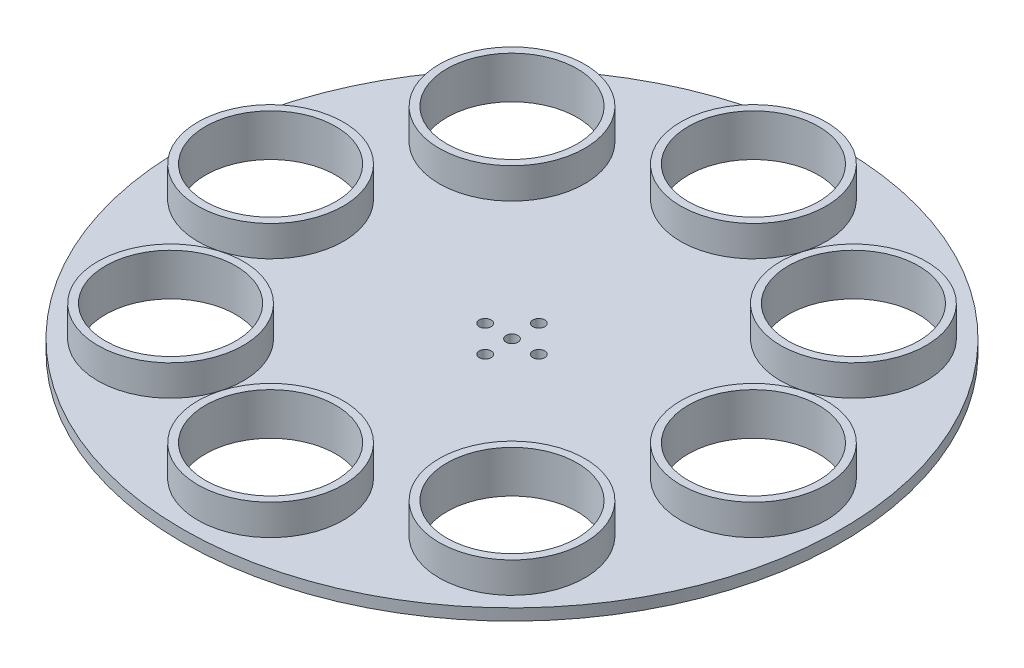
ISO-10303-21;
HEADER;
FILE_DESCRIPTION(('STEP AP214'),'2;1');
FILE_NAME('part.step','',(''),(''),'','','');
FILE_SCHEMA(('AUTOMOTIVE_DESIGN { 1 0 10303 214 1 1 1 1 }'));
ENDSEC;
DATA;
#1=APPLICATION_CONTEXT('core data for automotive mechanical design processes');
#2=APPLICATION_PROTOCOL_DEFINITION('international standard','automotive_design',2000,#1);
#3=PRODUCT_CONTEXT('',#1,'mechanical');
#4=PRODUCT('Part','Part','',(#3));
#5=PRODUCT_RELATED_PRODUCT_CATEGORY('part','',(#4));
#6=PRODUCT_DEFINITION_FORMATION('','',#4);
#7=PRODUCT_DEFINITION_CONTEXT('part definition',#1,'design');
#8=PRODUCT_DEFINITION('design','',#6,#7);
#9=PRODUCT_DEFINITION_SHAPE('','',#8);
#10=(LENGTH_UNIT() NAMED_UNIT(*) SI_UNIT(.MILLI.,.METRE.));
#11=(NAMED_UNIT(*) PLANE_ANGLE_UNIT() SI_UNIT($,.RADIAN.));
#12=(NAMED_UNIT(*) SI_UNIT($,.STERADIAN.) SOLID_ANGLE_UNIT());
#13=UNCERTAINTY_MEASURE_WITH_UNIT(LENGTH_MEASURE(1.E-05),#10,'distance_accuracy_value','');
#14=(GEOMETRIC_REPRESENTATION_CONTEXT(3) GLOBAL_UNCERTAINTY_ASSIGNED_CONTEXT((#13)) GLOBAL_UNIT_ASSIGNED_CONTEXT((#10,
#11,#12)) REPRESENTATION_CONTEXT('',''));
#15=CARTESIAN_POINT('',(0.,0.,0.));
#16=DIRECTION('',(0.,0.,1.));
#17=DIRECTION('',(1.,0.,0.));
#18=AXIS2_PLACEMENT_3D('',#15,#16,#17);
#19=CARTESIAN_POINT('',(-63.,11.,0.));
#20=DIRECTION('',(0.,-1.,0.));
#21=DIRECTION('',(0.,0.,-1.));
#22=AXIS2_PLACEMENT_3D('',#19,#20,#21);
#23=CYLINDRICAL_SURFACE('',#22,17.);
#24=CARTESIAN_POINT('',(-63.,11.,0.));
#25=DIRECTION('',(0.,1.,0.));
#26=DIRECTION('',(0.,0.,1.));
#27=AXIS2_PLACEMENT_3D('',#24,#25,#26);
#28=CIRCLE('',#27,17.);
#29=CARTESIAN_POINT('',(-63.,11.,17.));
#30=VERTEX_POINT('',#29);
#31=EDGE_CURVE('E46',#30,#30,#28,.T.);
#32=ORIENTED_EDGE('',*,*,#31,.T.);
#33=EDGE_LOOP('',(#32));
#34=FACE_BOUND('',#33,.T.);
#35=CARTESIAN_POINT('',(-63.,0.,0.));
#36=DIRECTION('',(0.,1.,0.));
#37=DIRECTION('',(0.,0.,1.));
#38=AXIS2_PLACEMENT_3D('',#35,#36,#37);
#39=CIRCLE('',#38,17.);
#40=CARTESIAN_POINT('',(-63.,0.,17.));
#41=VERTEX_POINT('',#40);
#42=EDGE_CURVE('E42',#41,#41,#39,.T.);
#43=ORIENTED_EDGE('',*,*,#42,.F.);
#44=EDGE_LOOP('',(#43));
#45=FACE_BOUND('',#44,.T.);
#46=ADVANCED_FACE('F39',(#34,#45),#23,.F.);
#47=CARTESIAN_POINT('',(-63.,11.,0.));
#48=DIRECTION('',(0.,-1.,0.));
#49=DIRECTION('',(0.,0.,-1.));
#50=AXIS2_PLACEMENT_3D('',#47,#48,#49);
#51=CYLINDRICAL_SURFACE('',#50,19.);
#52=CARTESIAN_POINT('',(-63.,3.,0.));
#53=DIRECTION('',(0.,1.,0.));
#54=DIRECTION('',(0.,0.,1.));
#55=AXIS2_PLACEMENT_3D('',#52,#53,#54);
#56=CIRCLE('',#55,19.);
#57=CARTESIAN_POINT('',(-63.,3.,19.));
#58=VERTEX_POINT('',#57);
#59=EDGE_CURVE('E55',#58,#58,#56,.T.);
#60=ORIENTED_EDGE('',*,*,#59,.T.);
#61=EDGE_LOOP('',(#60));
#62=FACE_BOUND('',#61,.T.);
#63=CARTESIAN_POINT('',(-63.,11.,0.));
#64=DIRECTION('',(0.,1.,0.));
#65=DIRECTION('',(0.,0.,1.));
#66=AXIS2_PLACEMENT_3D('',#63,#64,#65);
#67=CIRCLE('',#66,19.);
#68=CARTESIAN_POINT('',(-63.,11.,19.));
#69=VERTEX_POINT('',#68);
#70=EDGE_CURVE('E10',#69,#69,#67,.T.);
#71=ORIENTED_EDGE('',*,*,#70,.F.);
#72=EDGE_LOOP('',(#71));
#73=FACE_BOUND('',#72,.T.);
#74=ADVANCED_FACE('F195',(#62,#73),#51,.T.);
#75=CARTESIAN_POINT('',(0.,11.,0.));
#76=DIRECTION('',(0.,1.,0.));
#77=DIRECTION('',(0.,0.,1.));
#78=AXIS2_PLACEMENT_3D('',#75,#76,#77);
#79=PLANE('',#78);
#80=ORIENTED_EDGE('',*,*,#31,.F.);
#81=EDGE_LOOP('',(#80));
#82=FACE_BOUND('',#81,.T.);
#83=ORIENTED_EDGE('',*,*,#70,.T.);
#84=EDGE_LOOP('',(#83));
#85=FACE_BOUND('',#84,.T.);
#86=ADVANCED_FACE('F200',(#82,#85),#79,.T.);
#87=CARTESIAN_POINT('',(0.,0.,0.));
#88=DIRECTION('',(0.,1.,0.));
#89=DIRECTION('',(0.,0.,1.));
#90=AXIS2_PLACEMENT_3D('',#87,#88,#89);
#91=PLANE('',#90);
#92=ORIENTED_EDGE('',*,*,#42,.T.);
#93=EDGE_LOOP('',(#92));
#94=FACE_BOUND('',#93,.T.);
#95=CARTESIAN_POINT('',(0.,0.,7.));
#96=DIRECTION('',(0.,1.,0.));
#97=DIRECTION('',(0.,0.,1.));
#98=AXIS2_PLACEMENT_3D('',#95,#96,#97);
#99=CIRCLE('',#98,1.55);
#100=CARTESIAN_POINT('',(0.,0.,8.55));
#101=VERTEX_POINT('',#100);
#102=EDGE_CURVE('E68',#101,#101,#99,.T.);
#103=ORIENTED_EDGE('',*,*,#102,.T.);
#104=EDGE_LOOP('',(#103));
#105=FACE_BOUND('',#104,.T.);
#106=CARTESIAN_POINT('',(-7.,0.,0.));
#107=DIRECTION('',(0.,1.,0.));
#108=DIRECTION('',(0.,0.,1.));
#109=AXIS2_PLACEMENT_3D('',#106,#107,#108);
#110=CIRCLE('',#109,1.55);
#111=CARTESIAN_POINT('',(-7.,0.,1.55));
#112=VERTEX_POINT('',#111);
#113=EDGE_CURVE('E65',#112,#112,#110,.T.);
#114=ORIENTED_EDGE('',*,*,#113,.T.);
#115=EDGE_LOOP('',(#114));
#116=FACE_BOUND('',#115,.T.);
#117=CARTESIAN_POINT('',(7.,0.,0.));
#118=DIRECTION('',(0.,1.,0.));
#119=DIRECTION('',(0.,0.,1.));
#120=AXIS2_PLACEMENT_3D('',#117,#118,#119);
#121=CIRCLE('',#120,1.55);
#122=CARTESIAN_POINT('',(7.,0.,1.55));
#123=VERTEX_POINT('',#122);
#124=EDGE_CURVE('E62',#123,#123,#121,.T.);
#125=ORIENTED_EDGE('',*,*,#124,.T.);
#126=EDGE_LOOP('',(#125));
#127=FACE_BOUND('',#126,.T.);
#128=CARTESIAN_POINT('',(0.,0.,-7.));
#129=DIRECTION('',(0.,1.,0.));
#130=DIRECTION('',(0.,0.,1.));
#131=AXIS2_PLACEMENT_3D('',#128,#129,#130);
#132=CIRCLE('',#131,1.55);
#133=CARTESIAN_POINT('',(0.,0.,-5.45));
#134=VERTEX_POINT('',#133);
#135=EDGE_CURVE('E59',#134,#134,#132,.T.);
#136=ORIENTED_EDGE('',*,*,#135,.T.);
#137=EDGE_LOOP('',(#136));
#138=FACE_BOUND('',#137,.T.);
#139=CARTESIAN_POINT('',(0.,0.,0.));
#140=DIRECTION('',(0.,1.,0.));
#141=DIRECTION('',(0.,0.,1.));
#142=AXIS2_PLACEMENT_3D('',#139,#140,#141);
#143=CIRCLE('',#142,1.55);
#144=CARTESIAN_POINT('',(0.,0.,1.55));
#145=VERTEX_POINT('',#144);
#146=EDGE_CURVE('E56',#145,#145,#143,.T.);
#147=ORIENTED_EDGE('',*,*,#146,.T.);
#148=EDGE_LOOP('',(#147));
#149=FACE_BOUND('',#148,.T.);
#150=CARTESIAN_POINT('',(0.,0.,0.));
#151=DIRECTION('',(0.,1.,0.));
#152=DIRECTION('',(0.,0.,1.));
#153=AXIS2_PLACEMENT_3D('',#150,#151,#152);
#154=CIRCLE('',#153,86.);
#155=CARTESIAN_POINT('',(0.,0.,86.));
#156=VERTEX_POINT('',#155);
#157=EDGE_CURVE('E52',#156,#156,#154,.T.);
#158=ORIENTED_EDGE('',*,*,#157,.F.);
#159=EDGE_LOOP('',(#158));
#160=FACE_BOUND('',#159,.T.);
#161=CARTESIAN_POINT('',(-44.5477272147527,0.,44.5477272147523));
#162=DIRECTION('',(0.,1.,0.));
#163=DIRECTION('',(0.,0.,1.));
#164=AXIS2_PLACEMENT_3D('',#161,#162,#163);
#165=CIRCLE('',#164,17.);
#166=CARTESIAN_POINT('',(-44.5477272147527,0.,61.5477272147523));
#167=VERTEX_POINT('',#166);
#168=EDGE_CURVE('E113',#167,#167,#165,.T.);
#169=ORIENTED_EDGE('',*,*,#168,.T.);
#170=EDGE_LOOP('',(#169));
#171=FACE_BOUND('',#170,.T.);
#172=CARTESIAN_POINT('',(0.,0.,63.));
#173=DIRECTION('',(0.,1.,0.));
#174=DIRECTION('',(0.,0.,1.));
#175=AXIS2_PLACEMENT_3D('',#172,#173,#174);
#176=CIRCLE('',#175,17.);
#177=CARTESIAN_POINT('',(0.,0.,80.));
#178=VERTEX_POINT('',#177);
#179=EDGE_CURVE('E122',#178,#178,#176,.T.);
#180=ORIENTED_EDGE('',*,*,#179,.T.);
#181=EDGE_LOOP('',(#180));
#182=FACE_BOUND('',#181,.T.);
#183=CARTESIAN_POINT('',(44.5477272147524,0.,44.5477272147526));
#184=DIRECTION('',(0.,1.,0.));
#185=DIRECTION('',(0.,0.,1.));
#186=AXIS2_PLACEMENT_3D('',#183,#184,#185);
#187=CIRCLE('',#186,17.);
#188=CARTESIAN_POINT('',(44.5477272147524,0.,61.5477272147526));
#189=VERTEX_POINT('',#188);
#190=EDGE_CURVE('E131',#189,#189,#187,.T.);
#191=ORIENTED_EDGE('',*,*,#190,.T.);
#192=EDGE_LOOP('',(#191));
#193=FACE_BOUND('',#192,.T.);
#194=CARTESIAN_POINT('',(63.,0.,0.));
#195=DIRECTION('',(0.,1.,0.));
#196=DIRECTION('',(0.,0.,1.));
#197=AXIS2_PLACEMENT_3D('',#194,#195,#196);
#198=CIRCLE('',#197,17.);
#199=CARTESIAN_POINT('',(63.,0.,17.));
#200=VERTEX_POINT('',#199);
#201=EDGE_CURVE('E140',#200,#200,#198,.T.);
#202=ORIENTED_EDGE('',*,*,#201,.T.);
#203=EDGE_LOOP('',(#202));
#204=FACE_BOUND('',#203,.T.);
#205=CARTESIAN_POINT('',(0.,0.,-63.));
#206=DIRECTION('',(0.,1.,0.));
#207=DIRECTION('',(0.,0.,1.));
#208=AXIS2_PLACEMENT_3D('',#205,#206,#207);
#209=CIRCLE('',#208,17.);
#210=CARTESIAN_POINT('',(0.,0.,-46.));
#211=VERTEX_POINT('',#210);
#212=EDGE_CURVE('E149',#211,#211,#209,.T.);
#213=ORIENTED_EDGE('',*,*,#212,.T.);
#214=EDGE_LOOP('',(#213));
#215=FACE_BOUND('',#214,.T.);
#216=CARTESIAN_POINT('',(44.5477272147524,0.,-44.5477272147526));
#217=DIRECTION('',(0.,1.,0.));
#218=DIRECTION('',(0.,0.,1.));
#219=AXIS2_PLACEMENT_3D('',#216,#217,#218);
#220=CIRCLE('',#219,17.);
#221=CARTESIAN_POINT('',(44.5477272147524,0.,-27.5477272147526));
#222=VERTEX_POINT('',#221);
#223=EDGE_CURVE('E158',#222,#222,#220,.T.);
#224=ORIENTED_EDGE('',*,*,#223,.T.);
#225=EDGE_LOOP('',(#224));
#226=FACE_BOUND('',#225,.T.);
#227=CARTESIAN_POINT('',(-44.5443393662999,0.,-44.5443393662995));
#228=DIRECTION('',(0.,1.,0.));
#229=DIRECTION('',(0.,0.,1.));
#230=AXIS2_PLACEMENT_3D('',#227,#228,#229);
#231=CIRCLE('',#230,17.);
#232=CARTESIAN_POINT('',(-44.5443393662999,0.,-27.5443393662995));
#233=VERTEX_POINT('',#232);
#234=EDGE_CURVE('E167',#233,#233,#231,.T.);
#235=ORIENTED_EDGE('',*,*,#234,.T.);
#236=EDGE_LOOP('',(#235));
#237=FACE_BOUND('',#236,.T.);
#238=ADVANCED_FACE('F207',(#94,#105,#116,#127,#138,#149,#160,#171,#182,#193,#204,#215,#226,
#237),#91,.F.);
#239=CARTESIAN_POINT('',(0.,3.,0.));
#240=DIRECTION('',(0.,-1.,0.));
#241=DIRECTION('',(0.,0.,-1.));
#242=AXIS2_PLACEMENT_3D('',#239,#240,#241);
#243=CYLINDRICAL_SURFACE('',#242,1.55);
#244=CARTESIAN_POINT('',(0.,3.,0.));
#245=DIRECTION('',(0.,1.,0.));
#246=DIRECTION('',(0.,0.,1.));
#247=AXIS2_PLACEMENT_3D('',#244,#245,#246);
#248=CIRCLE('',#247,1.55);
#249=CARTESIAN_POINT('',(0.,3.,1.55));
#250=VERTEX_POINT('',#249);
#251=EDGE_CURVE('E75',#250,#250,#248,.T.);
#252=ORIENTED_EDGE('',*,*,#251,.T.);
#253=EDGE_LOOP('',(#252));
#254=FACE_BOUND('',#253,.T.);
#255=ORIENTED_EDGE('',*,*,#146,.F.);
#256=EDGE_LOOP('',(#255));
#257=FACE_BOUND('',#256,.T.);
#258=ADVANCED_FACE('F210',(#254,#257),#243,.F.);
#259=CARTESIAN_POINT('',(0.,3.,-7.));
#260=DIRECTION('',(0.,-1.,0.));
#261=DIRECTION('',(0.,0.,-1.));
#262=AXIS2_PLACEMENT_3D('',#259,#260,#261);
#263=CYLINDRICAL_SURFACE('',#262,1.55);
#264=CARTESIAN_POINT('',(0.,3.,-7.));
#265=DIRECTION('',(0.,1.,0.));
#266=DIRECTION('',(0.,0.,1.));
#267=AXIS2_PLACEMENT_3D('',#264,#265,#266);
#268=CIRCLE('',#267,1.55);
#269=CARTESIAN_POINT('',(0.,3.,-5.45));
#270=VERTEX_POINT('',#269);
#271=EDGE_CURVE('E78',#270,#270,#268,.T.);
#272=ORIENTED_EDGE('',*,*,#271,.T.);
#273=EDGE_LOOP('',(#272));
#274=FACE_BOUND('',#273,.T.);
#275=ORIENTED_EDGE('',*,*,#135,.F.);
#276=EDGE_LOOP('',(#275));
#277=FACE_BOUND('',#276,.T.);
#278=ADVANCED_FACE('F321',(#274,#277),#263,.F.);
#279=CARTESIAN_POINT('',(7.,3.,0.));
#280=DIRECTION('',(0.,-1.,0.));
#281=DIRECTION('',(0.,0.,-1.));
#282=AXIS2_PLACEMENT_3D('',#279,#280,#281);
#283=CYLINDRICAL_SURFACE('',#282,1.55);
#284=CARTESIAN_POINT('',(7.,3.,0.));
#285=DIRECTION('',(0.,1.,0.));
#286=DIRECTION('',(0.,0.,1.));
#287=AXIS2_PLACEMENT_3D('',#284,#285,#286);
#288=CIRCLE('',#287,1.55);
#289=CARTESIAN_POINT('',(7.,3.,1.55));
#290=VERTEX_POINT('',#289);
#291=EDGE_CURVE('E81',#290,#290,#288,.T.);
#292=ORIENTED_EDGE('',*,*,#291,.T.);
#293=EDGE_LOOP('',(#292));
#294=FACE_BOUND('',#293,.T.);
#295=ORIENTED_EDGE('',*,*,#124,.F.);
#296=EDGE_LOOP('',(#295));
#297=FACE_BOUND('',#296,.T.);
#298=ADVANCED_FACE('F325',(#294,#297),#283,.F.);
#299=CARTESIAN_POINT('',(-7.,3.,0.));
#300=DIRECTION('',(0.,-1.,0.));
#301=DIRECTION('',(0.,0.,-1.));
#302=AXIS2_PLACEMENT_3D('',#299,#300,#301);
#303=CYLINDRICAL_SURFACE('',#302,1.55);
#304=CARTESIAN_POINT('',(-7.,3.,0.));
#305=DIRECTION('',(0.,1.,0.));
#306=DIRECTION('',(0.,0.,1.));
#307=AXIS2_PLACEMENT_3D('',#304,#305,#306);
#308=CIRCLE('',#307,1.55);
#309=CARTESIAN_POINT('',(-7.,3.,1.55));
#310=VERTEX_POINT('',#309);
#311=EDGE_CURVE('E84',#310,#310,#308,.T.);
#312=ORIENTED_EDGE('',*,*,#311,.T.);
#313=EDGE_LOOP('',(#312));
#314=FACE_BOUND('',#313,.T.);
#315=ORIENTED_EDGE('',*,*,#113,.F.);
#316=EDGE_LOOP('',(#315));
#317=FACE_BOUND('',#316,.T.);
#318=ADVANCED_FACE('F329',(#314,#317),#303,.F.);
#319=CARTESIAN_POINT('',(0.,3.,7.));
#320=DIRECTION('',(0.,-1.,0.));
#321=DIRECTION('',(0.,0.,-1.));
#322=AXIS2_PLACEMENT_3D('',#319,#320,#321);
#323=CYLINDRICAL_SURFACE('',#322,1.55);
#324=CARTESIAN_POINT('',(0.,3.,7.));
#325=DIRECTION('',(0.,1.,0.));
#326=DIRECTION('',(0.,0.,1.));
#327=AXIS2_PLACEMENT_3D('',#324,#325,#326);
#328=CIRCLE('',#327,1.55);
#329=CARTESIAN_POINT('',(0.,3.,8.55));
#330=VERTEX_POINT('',#329);
#331=EDGE_CURVE('E87',#330,#330,#328,.T.);
#332=ORIENTED_EDGE('',*,*,#331,.T.);
#333=EDGE_LOOP('',(#332));
#334=FACE_BOUND('',#333,.T.);
#335=ORIENTED_EDGE('',*,*,#102,.F.);
#336=EDGE_LOOP('',(#335));
#337=FACE_BOUND('',#336,.T.);
#338=ADVANCED_FACE('F317',(#334,#337),#323,.F.);
#339=CARTESIAN_POINT('',(0.,3.,0.));
#340=DIRECTION('',(0.,-1.,0.));
#341=DIRECTION('',(0.,0.,-1.));
#342=AXIS2_PLACEMENT_3D('',#339,#340,#341);
#343=CYLINDRICAL_SURFACE('',#342,86.);
#344=CARTESIAN_POINT('',(0.,3.,0.));
#345=DIRECTION('',(0.,1.,0.));
#346=DIRECTION('',(0.,0.,1.));
#347=AXIS2_PLACEMENT_3D('',#344,#345,#346);
#348=CIRCLE('',#347,86.);
#349=CARTESIAN_POINT('',(0.,3.,86.));
#350=VERTEX_POINT('',#349);
#351=EDGE_CURVE('E72',#350,#350,#348,.T.);
#352=ORIENTED_EDGE('',*,*,#351,.F.);
#353=EDGE_LOOP('',(#352));
#354=FACE_BOUND('',#353,.T.);
#355=ORIENTED_EDGE('',*,*,#157,.T.);
#356=EDGE_LOOP('',(#355));
#357=FACE_BOUND('',#356,.T.);
#358=ADVANCED_FACE('F313',(#354,#357),#343,.T.);
#359=CARTESIAN_POINT('',(0.,3.,0.));
#360=DIRECTION('',(0.,1.,0.));
#361=DIRECTION('',(0.,0.,1.));
#362=AXIS2_PLACEMENT_3D('',#359,#360,#361);
#363=PLANE('',#362);
#364=ORIENTED_EDGE('',*,*,#59,.F.);
#365=EDGE_LOOP('',(#364));
#366=FACE_BOUND('',#365,.T.);
#367=CARTESIAN_POINT('',(-44.5477272147527,3.,44.5477272147523));
#368=DIRECTION('',(0.,1.,0.));
#369=DIRECTION('',(0.,0.,1.));
#370=AXIS2_PLACEMENT_3D('',#367,#368,#369);
#371=CIRCLE('',#370,19.);
#372=CARTESIAN_POINT('',(-44.5477272147527,3.,63.5477272147523));
#373=VERTEX_POINT('',#372);
#374=EDGE_CURVE('E108',#373,#373,#371,.T.);
#375=ORIENTED_EDGE('',*,*,#374,.F.);
#376=EDGE_LOOP('',(#375));
#377=FACE_BOUND('',#376,.T.);
#378=CARTESIAN_POINT('',(0.,3.,63.));
#379=DIRECTION('',(0.,1.,0.));
#380=DIRECTION('',(0.,0.,1.));
#381=AXIS2_PLACEMENT_3D('',#378,#379,#380);
#382=CIRCLE('',#381,19.);
#383=CARTESIAN_POINT('',(0.,3.,82.));
#384=VERTEX_POINT('',#383);
#385=EDGE_CURVE('E105',#384,#384,#382,.T.);
#386=ORIENTED_EDGE('',*,*,#385,.F.);
#387=EDGE_LOOP('',(#386));
#388=FACE_BOUND('',#387,.T.);
#389=CARTESIAN_POINT('',(44.5477272147524,3.,44.5477272147526));
#390=DIRECTION('',(0.,1.,0.));
#391=DIRECTION('',(0.,0.,1.));
#392=AXIS2_PLACEMENT_3D('',#389,#390,#391);
#393=CIRCLE('',#392,19.);
#394=CARTESIAN_POINT('',(44.5477272147524,3.,63.5477272147526));
#395=VERTEX_POINT('',#394);
#396=EDGE_CURVE('E102',#395,#395,#393,.T.);
#397=ORIENTED_EDGE('',*,*,#396,.F.);
#398=EDGE_LOOP('',(#397));
#399=FACE_BOUND('',#398,.T.);
#400=CARTESIAN_POINT('',(63.,3.,0.));
#401=DIRECTION('',(0.,1.,0.));
#402=DIRECTION('',(0.,0.,1.));
#403=AXIS2_PLACEMENT_3D('',#400,#401,#402);
#404=CIRCLE('',#403,19.);
#405=CARTESIAN_POINT('',(63.,3.,19.));
#406=VERTEX_POINT('',#405);
#407=EDGE_CURVE('E99',#406,#406,#404,.T.);
#408=ORIENTED_EDGE('',*,*,#407,.F.);
#409=EDGE_LOOP('',(#408));
#410=FACE_BOUND('',#409,.T.);
#411=CARTESIAN_POINT('',(44.5477272147524,3.,-44.5477272147526));
#412=DIRECTION('',(0.,1.,0.));
#413=DIRECTION('',(0.,0.,1.));
#414=AXIS2_PLACEMENT_3D('',#411,#412,#413);
#415=CIRCLE('',#414,19.);
#416=CARTESIAN_POINT('',(44.5477272147524,3.,-25.5477272147526));
#417=VERTEX_POINT('',#416);
#418=EDGE_CURVE('E96',#417,#417,#415,.T.);
#419=ORIENTED_EDGE('',*,*,#418,.F.);
#420=EDGE_LOOP('',(#419));
#421=FACE_BOUND('',#420,.T.);
#422=CARTESIAN_POINT('',(0.,3.,-63.));
#423=DIRECTION('',(0.,1.,0.));
#424=DIRECTION('',(0.,0.,1.));
#425=AXIS2_PLACEMENT_3D('',#422,#423,#424);
#426=CIRCLE('',#425,19.);
#427=CARTESIAN_POINT('',(0.,3.,-44.));
#428=VERTEX_POINT('',#427);
#429=EDGE_CURVE('E93',#428,#428,#426,.T.);
#430=ORIENTED_EDGE('',*,*,#429,.F.);
#431=EDGE_LOOP('',(#430));
#432=FACE_BOUND('',#431,.T.);
#433=CARTESIAN_POINT('',(-44.5443393662999,3.,-44.5443393662995));
#434=DIRECTION('',(0.,1.,0.));
#435=DIRECTION('',(0.,0.,1.));
#436=AXIS2_PLACEMENT_3D('',#433,#434,#435);
#437=CIRCLE('',#436,19.);
#438=CARTESIAN_POINT('',(-44.5443393662999,3.,-25.5443393662995));
#439=VERTEX_POINT('',#438);
#440=EDGE_CURVE('E90',#439,#439,#437,.T.);
#441=ORIENTED_EDGE('',*,*,#440,.F.);
#442=EDGE_LOOP('',(#441));
#443=FACE_BOUND('',#442,.T.);
#444=ORIENTED_EDGE('',*,*,#331,.F.);
#445=EDGE_LOOP('',(#444));
#446=FACE_BOUND('',#445,.T.);
#447=ORIENTED_EDGE('',*,*,#311,.F.);
#448=EDGE_LOOP('',(#447));
#449=FACE_BOUND('',#448,.T.);
#450=ORIENTED_EDGE('',*,*,#291,.F.);
#451=EDGE_LOOP('',(#450));
#452=FACE_BOUND('',#451,.T.);
#453=ORIENTED_EDGE('',*,*,#271,.F.);
#454=EDGE_LOOP('',(#453));
#455=FACE_BOUND('',#454,.T.);
#456=ORIENTED_EDGE('',*,*,#251,.F.);
#457=EDGE_LOOP('',(#456));
#458=FACE_BOUND('',#457,.T.);
#459=ORIENTED_EDGE('',*,*,#351,.T.);
#460=EDGE_LOOP('',(#459));
#461=FACE_BOUND('',#460,.T.);
#462=ADVANCED_FACE('F309',(#366,#377,#388,#399,#410,#421,#432,#443,#446,#449,#452,#455,#458,
#461),#363,.T.);
#463=CARTESIAN_POINT('',(-44.5477272147527,11.,44.5477272147523));
#464=DIRECTION('',(0.,-1.,0.));
#465=DIRECTION('',(0.,0.,-1.));
#466=AXIS2_PLACEMENT_3D('',#463,#464,#465);
#467=CYLINDRICAL_SURFACE('',#466,17.);
#468=CARTESIAN_POINT('',(-44.5477272147527,11.,44.5477272147523));
#469=DIRECTION('',(0.,1.,0.));
#470=DIRECTION('',(0.,0.,1.));
#471=AXIS2_PLACEMENT_3D('',#468,#469,#470);
#472=CIRCLE('',#471,17.);
#473=CARTESIAN_POINT('',(-44.5477272147527,11.,61.5477272147523));
#474=VERTEX_POINT('',#473);
#475=EDGE_CURVE('E116',#474,#474,#472,.T.);
#476=ORIENTED_EDGE('',*,*,#475,.T.);
#477=EDGE_LOOP('',(#476));
#478=FACE_BOUND('',#477,.T.);
#479=ORIENTED_EDGE('',*,*,#168,.F.);
#480=EDGE_LOOP('',(#479));
#481=FACE_BOUND('',#480,.T.);
#482=ADVANCED_FACE('F305',(#478,#481),#467,.F.);
#483=CARTESIAN_POINT('',(-44.5477272147527,11.,44.5477272147523));
#484=DIRECTION('',(0.,-1.,0.));
#485=DIRECTION('',(0.,0.,-1.));
#486=AXIS2_PLACEMENT_3D('',#483,#484,#485);
#487=CYLINDRICAL_SURFACE('',#486,19.);
#488=ORIENTED_EDGE('',*,*,#374,.T.);
#489=EDGE_LOOP('',(#488));
#490=FACE_BOUND('',#489,.T.);
#491=CARTESIAN_POINT('',(-44.5477272147527,11.,44.5477272147523));
#492=DIRECTION('',(0.,1.,0.));
#493=DIRECTION('',(0.,0.,1.));
#494=AXIS2_PLACEMENT_3D('',#491,#492,#493);
#495=CIRCLE('',#494,19.);
#496=CARTESIAN_POINT('',(-44.5477272147527,11.,63.5477272147523));
#497=VERTEX_POINT('',#496);
#498=EDGE_CURVE('E71',#497,#497,#495,.T.);
#499=ORIENTED_EDGE('',*,*,#498,.F.);
#500=EDGE_LOOP('',(#499));
#501=FACE_BOUND('',#500,.T.);
#502=ADVANCED_FACE('F301',(#490,#501),#487,.T.);
#503=CARTESIAN_POINT('',(0.,11.,0.));
#504=DIRECTION('',(0.,1.,0.));
#505=DIRECTION('',(0.,0.,1.));
#506=AXIS2_PLACEMENT_3D('',#503,#504,#505);
#507=PLANE('',#506);
#508=ORIENTED_EDGE('',*,*,#475,.F.);
#509=EDGE_LOOP('',(#508));
#510=FACE_BOUND('',#509,.T.);
#511=ORIENTED_EDGE('',*,*,#498,.T.);
#512=EDGE_LOOP('',(#511));
#513=FACE_BOUND('',#512,.T.);
#514=ADVANCED_FACE('F297',(#510,#513),#507,.T.);
#515=CARTESIAN_POINT('',(0.,11.,63.));
#516=DIRECTION('',(0.,-1.,0.));
#517=DIRECTION('',(0.,0.,-1.));
#518=AXIS2_PLACEMENT_3D('',#515,#516,#517);
#519=CYLINDRICAL_SURFACE('',#518,17.);
#520=CARTESIAN_POINT('',(0.,11.,63.));
#521=DIRECTION('',(0.,1.,0.));
#522=DIRECTION('',(0.,0.,1.));
#523=AXIS2_PLACEMENT_3D('',#520,#521,#522);
#524=CIRCLE('',#523,17.);
#525=CARTESIAN_POINT('',(0.,11.,80.));
#526=VERTEX_POINT('',#525);
#527=EDGE_CURVE('E125',#526,#526,#524,.T.);
#528=ORIENTED_EDGE('',*,*,#527,.T.);
#529=EDGE_LOOP('',(#528));
#530=FACE_BOUND('',#529,.T.);
#531=ORIENTED_EDGE('',*,*,#179,.F.);
#532=EDGE_LOOP('',(#531));
#533=FACE_BOUND('',#532,.T.);
#534=ADVANCED_FACE('F293',(#530,#533),#519,.F.);
#535=CARTESIAN_POINT('',(0.,11.,63.));
#536=DIRECTION('',(0.,-1.,0.));
#537=DIRECTION('',(0.,0.,-1.));
#538=AXIS2_PLACEMENT_3D('',#535,#536,#537);
#539=CYLINDRICAL_SURFACE('',#538,19.);
#540=ORIENTED_EDGE('',*,*,#385,.T.);
#541=EDGE_LOOP('',(#540));
#542=FACE_BOUND('',#541,.T.);
#543=CARTESIAN_POINT('',(0.,11.,63.));
#544=DIRECTION('',(0.,1.,0.));
#545=DIRECTION('',(0.,0.,1.));
#546=AXIS2_PLACEMENT_3D('',#543,#544,#545);
#547=CIRCLE('',#546,19.);
#548=CARTESIAN_POINT('',(0.,11.,82.));
#549=VERTEX_POINT('',#548);
#550=EDGE_CURVE('E117',#549,#549,#547,.T.);
#551=ORIENTED_EDGE('',*,*,#550,.F.);
#552=EDGE_LOOP('',(#551));
#553=FACE_BOUND('',#552,.T.);
#554=ADVANCED_FACE('F289',(#542,#553),#539,.T.);
#555=CARTESIAN_POINT('',(0.,11.,0.));
#556=DIRECTION('',(0.,1.,0.));
#557=DIRECTION('',(0.,0.,1.));
#558=AXIS2_PLACEMENT_3D('',#555,#556,#557);
#559=PLANE('',#558);
#560=ORIENTED_EDGE('',*,*,#527,.F.);
#561=EDGE_LOOP('',(#560));
#562=FACE_BOUND('',#561,.T.);
#563=ORIENTED_EDGE('',*,*,#550,.T.);
#564=EDGE_LOOP('',(#563));
#565=FACE_BOUND('',#564,.T.);
#566=ADVANCED_FACE('F285',(#562,#565),#559,.T.);
#567=CARTESIAN_POINT('',(44.5477272147524,11.,44.5477272147526));
#568=DIRECTION('',(0.,-1.,0.));
#569=DIRECTION('',(0.,0.,-1.));
#570=AXIS2_PLACEMENT_3D('',#567,#568,#569);
#571=CYLINDRICAL_SURFACE('',#570,17.);
#572=CARTESIAN_POINT('',(44.5477272147524,11.,44.5477272147526));
#573=DIRECTION('',(0.,1.,0.));
#574=DIRECTION('',(0.,0.,1.));
#575=AXIS2_PLACEMENT_3D('',#572,#573,#574);
#576=CIRCLE('',#575,17.);
#577=CARTESIAN_POINT('',(44.5477272147524,11.,61.5477272147526));
#578=VERTEX_POINT('',#577);
#579=EDGE_CURVE('E134',#578,#578,#576,.T.);
#580=ORIENTED_EDGE('',*,*,#579,.T.);
#581=EDGE_LOOP('',(#580));
#582=FACE_BOUND('',#581,.T.);
#583=ORIENTED_EDGE('',*,*,#190,.F.);
#584=EDGE_LOOP('',(#583));
#585=FACE_BOUND('',#584,.T.);
#586=ADVANCED_FACE('F281',(#582,#585),#571,.F.);
#587=CARTESIAN_POINT('',(44.5477272147524,11.,44.5477272147526));
#588=DIRECTION('',(0.,-1.,0.));
#589=DIRECTION('',(0.,0.,-1.));
#590=AXIS2_PLACEMENT_3D('',#587,#588,#589);
#591=CYLINDRICAL_SURFACE('',#590,19.);
#592=ORIENTED_EDGE('',*,*,#396,.T.);
#593=EDGE_LOOP('',(#592));
#594=FACE_BOUND('',#593,.T.);
#595=CARTESIAN_POINT('',(44.5477272147524,11.,44.5477272147526));
#596=DIRECTION('',(0.,1.,0.));
#597=DIRECTION('',(0.,0.,1.));
#598=AXIS2_PLACEMENT_3D('',#595,#596,#597);
#599=CIRCLE('',#598,19.);
#600=CARTESIAN_POINT('',(44.5477272147524,11.,63.5477272147526));
#601=VERTEX_POINT('',#600);
#602=EDGE_CURVE('E126',#601,#601,#599,.T.);
#603=ORIENTED_EDGE('',*,*,#602,.F.);
#604=EDGE_LOOP('',(#603));
#605=FACE_BOUND('',#604,.T.);
#606=ADVANCED_FACE('F277',(#594,#605),#591,.T.);
#607=CARTESIAN_POINT('',(0.,11.,0.));
#608=DIRECTION('',(0.,1.,0.));
#609=DIRECTION('',(0.,0.,1.));
#610=AXIS2_PLACEMENT_3D('',#607,#608,#609);
#611=PLANE('',#610);
#612=ORIENTED_EDGE('',*,*,#579,.F.);
#613=EDGE_LOOP('',(#612));
#614=FACE_BOUND('',#613,.T.);
#615=ORIENTED_EDGE('',*,*,#602,.T.);
#616=EDGE_LOOP('',(#615));
#617=FACE_BOUND('',#616,.T.);
#618=ADVANCED_FACE('F273',(#614,#617),#611,.T.);
#619=CARTESIAN_POINT('',(63.,11.,0.));
#620=DIRECTION('',(0.,-1.,0.));
#621=DIRECTION('',(0.,0.,-1.));
#622=AXIS2_PLACEMENT_3D('',#619,#620,#621);
#623=CYLINDRICAL_SURFACE('',#622,17.);
#624=CARTESIAN_POINT('',(63.,11.,0.));
#625=DIRECTION('',(0.,1.,0.));
#626=DIRECTION('',(0.,0.,1.));
#627=AXIS2_PLACEMENT_3D('',#624,#625,#626);
#628=CIRCLE('',#627,17.);
#629=CARTESIAN_POINT('',(63.,11.,17.));
#630=VERTEX_POINT('',#629);
#631=EDGE_CURVE('E143',#630,#630,#628,.T.);
#632=ORIENTED_EDGE('',*,*,#631,.T.);
#633=EDGE_LOOP('',(#632));
#634=FACE_BOUND('',#633,.T.);
#635=ORIENTED_EDGE('',*,*,#201,.F.);
#636=EDGE_LOOP('',(#635));
#637=FACE_BOUND('',#636,.T.);
#638=ADVANCED_FACE('F269',(#634,#637),#623,.F.);
#639=CARTESIAN_POINT('',(63.,11.,0.));
#640=DIRECTION('',(0.,-1.,0.));
#641=DIRECTION('',(0.,0.,-1.));
#642=AXIS2_PLACEMENT_3D('',#639,#640,#641);
#643=CYLINDRICAL_SURFACE('',#642,19.);
#644=ORIENTED_EDGE('',*,*,#407,.T.);
#645=EDGE_LOOP('',(#644));
#646=FACE_BOUND('',#645,.T.);
#647=CARTESIAN_POINT('',(63.,11.,0.));
#648=DIRECTION('',(0.,1.,0.));
#649=DIRECTION('',(0.,0.,1.));
#650=AXIS2_PLACEMENT_3D('',#647,#648,#649);
#651=CIRCLE('',#650,19.);
#652=CARTESIAN_POINT('',(63.,11.,19.));
#653=VERTEX_POINT('',#652);
#654=EDGE_CURVE('E135',#653,#653,#651,.T.);
#655=ORIENTED_EDGE('',*,*,#654,.F.);
#656=EDGE_LOOP('',(#655));
#657=FACE_BOUND('',#656,.T.);
#658=ADVANCED_FACE('F265',(#646,#657),#643,.T.);
#659=CARTESIAN_POINT('',(0.,11.,0.));
#660=DIRECTION('',(0.,1.,0.));
#661=DIRECTION('',(0.,0.,1.));
#662=AXIS2_PLACEMENT_3D('',#659,#660,#661);
#663=PLANE('',#662);
#664=ORIENTED_EDGE('',*,*,#631,.F.);
#665=EDGE_LOOP('',(#664));
#666=FACE_BOUND('',#665,.T.);
#667=ORIENTED_EDGE('',*,*,#654,.T.);
#668=EDGE_LOOP('',(#667));
#669=FACE_BOUND('',#668,.T.);
#670=ADVANCED_FACE('F261',(#666,#669),#663,.T.);
#671=CARTESIAN_POINT('',(0.,11.,-63.));
#672=DIRECTION('',(0.,-1.,0.));
#673=DIRECTION('',(0.,0.,-1.));
#674=AXIS2_PLACEMENT_3D('',#671,#672,#673);
#675=CYLINDRICAL_SURFACE('',#674,17.);
#676=CARTESIAN_POINT('',(0.,11.,-63.));
#677=DIRECTION('',(0.,1.,0.));
#678=DIRECTION('',(0.,0.,1.));
#679=AXIS2_PLACEMENT_3D('',#676,#677,#678);
#680=CIRCLE('',#679,17.);
#681=CARTESIAN_POINT('',(0.,11.,-46.));
#682=VERTEX_POINT('',#681);
#683=EDGE_CURVE('E152',#682,#682,#680,.T.);
#684=ORIENTED_EDGE('',*,*,#683,.T.);
#685=EDGE_LOOP('',(#684));
#686=FACE_BOUND('',#685,.T.);
#687=ORIENTED_EDGE('',*,*,#212,.F.);
#688=EDGE_LOOP('',(#687));
#689=FACE_BOUND('',#688,.T.);
#690=ADVANCED_FACE('F257',(#686,#689),#675,.F.);
#691=CARTESIAN_POINT('',(0.,11.,-63.));
#692=DIRECTION('',(0.,-1.,0.));
#693=DIRECTION('',(0.,0.,-1.));
#694=AXIS2_PLACEMENT_3D('',#691,#692,#693);
#695=CYLINDRICAL_SURFACE('',#694,19.);
#696=ORIENTED_EDGE('',*,*,#429,.T.);
#697=EDGE_LOOP('',(#696));
#698=FACE_BOUND('',#697,.T.);
#699=CARTESIAN_POINT('',(0.,11.,-63.));
#700=DIRECTION('',(0.,1.,0.));
#701=DIRECTION('',(0.,0.,1.));
#702=AXIS2_PLACEMENT_3D('',#699,#700,#701);
#703=CIRCLE('',#702,19.);
#704=CARTESIAN_POINT('',(0.,11.,-44.));
#705=VERTEX_POINT('',#704);
#706=EDGE_CURVE('E144',#705,#705,#703,.T.);
#707=ORIENTED_EDGE('',*,*,#706,.F.);
#708=EDGE_LOOP('',(#707));
#709=FACE_BOUND('',#708,.T.);
#710=ADVANCED_FACE('F250',(#698,#709),#695,.T.);
#711=CARTESIAN_POINT('',(0.,11.,0.));
#712=DIRECTION('',(0.,1.,0.));
#713=DIRECTION('',(0.,0.,1.));
#714=AXIS2_PLACEMENT_3D('',#711,#712,#713);
#715=PLANE('',#714);
#716=ORIENTED_EDGE('',*,*,#683,.F.);
#717=EDGE_LOOP('',(#716));
#718=FACE_BOUND('',#717,.T.);
#719=ORIENTED_EDGE('',*,*,#706,.T.);
#720=EDGE_LOOP('',(#719));
#721=FACE_BOUND('',#720,.T.);
#722=ADVANCED_FACE('F241',(#718,#721),#715,.T.);
#723=CARTESIAN_POINT('',(44.5477272147524,11.,-44.5477272147526));
#724=DIRECTION('',(0.,-1.,0.));
#725=DIRECTION('',(0.,0.,-1.));
#726=AXIS2_PLACEMENT_3D('',#723,#724,#725);
#727=CYLINDRICAL_SURFACE('',#726,17.);
#728=CARTESIAN_POINT('',(44.5477272147524,11.,-44.5477272147526));
#729=DIRECTION('',(0.,1.,0.));
#730=DIRECTION('',(0.,0.,1.));
#731=AXIS2_PLACEMENT_3D('',#728,#729,#730);
#732=CIRCLE('',#731,17.);
#733=CARTESIAN_POINT('',(44.5477272147524,11.,-27.5477272147526));
#734=VERTEX_POINT('',#733);
#735=EDGE_CURVE('E161',#734,#734,#732,.T.);
#736=ORIENTED_EDGE('',*,*,#735,.T.);
#737=EDGE_LOOP('',(#736));
#738=FACE_BOUND('',#737,.T.);
#739=ORIENTED_EDGE('',*,*,#223,.F.);
#740=EDGE_LOOP('',(#739));
#741=FACE_BOUND('',#740,.T.);
#742=ADVANCED_FACE('F238',(#738,#741),#727,.F.);
#743=CARTESIAN_POINT('',(44.5477272147524,11.,-44.5477272147526));
#744=DIRECTION('',(0.,-1.,0.));
#745=DIRECTION('',(0.,0.,-1.));
#746=AXIS2_PLACEMENT_3D('',#743,#744,#745);
#747=CYLINDRICAL_SURFACE('',#746,19.);
#748=ORIENTED_EDGE('',*,*,#418,.T.);
#749=EDGE_LOOP('',(#748));
#750=FACE_BOUND('',#749,.T.);
#751=CARTESIAN_POINT('',(44.5477272147524,11.,-44.5477272147526));
#752=DIRECTION('',(0.,1.,0.));
#753=DIRECTION('',(0.,0.,1.));
#754=AXIS2_PLACEMENT_3D('',#751,#752,#753);
#755=CIRCLE('',#754,19.);
#756=CARTESIAN_POINT('',(44.5477272147524,11.,-25.5477272147526));
#757=VERTEX_POINT('',#756);
#758=EDGE_CURVE('E153',#757,#757,#755,.T.);
#759=ORIENTED_EDGE('',*,*,#758,.F.);
#760=EDGE_LOOP('',(#759));
#761=FACE_BOUND('',#760,.T.);
#762=ADVANCED_FACE('F240',(#750,#761),#747,.T.);
#763=CARTESIAN_POINT('',(0.,11.,0.));
#764=DIRECTION('',(0.,1.,0.));
#765=DIRECTION('',(0.,0.,1.));
#766=AXIS2_PLACEMENT_3D('',#763,#764,#765);
#767=PLANE('',#766);
#768=ORIENTED_EDGE('',*,*,#735,.F.);
#769=EDGE_LOOP('',(#768));
#770=FACE_BOUND('',#769,.T.);
#771=ORIENTED_EDGE('',*,*,#758,.T.);
#772=EDGE_LOOP('',(#771));
#773=FACE_BOUND('',#772,.T.);
#774=ADVANCED_FACE('F192',(#770,#773),#767,.T.);
#775=CARTESIAN_POINT('',(-44.5443393662999,11.,-44.5443393662995));
#776=DIRECTION('',(0.,-1.,0.));
#777=DIRECTION('',(0.,0.,-1.));
#778=AXIS2_PLACEMENT_3D('',#775,#776,#777);
#779=CYLINDRICAL_SURFACE('',#778,17.);
#780=CARTESIAN_POINT('',(-44.5443393662999,11.,-44.5443393662995));
#781=DIRECTION('',(0.,1.,0.));
#782=DIRECTION('',(0.,0.,1.));
#783=AXIS2_PLACEMENT_3D('',#780,#781,#782);
#784=CIRCLE('',#783,17.);
#785=CARTESIAN_POINT('',(-44.5443393662999,11.,-27.5443393662995));
#786=VERTEX_POINT('',#785);
#787=EDGE_CURVE('E170',#786,#786,#784,.T.);
#788=ORIENTED_EDGE('',*,*,#787,.T.);
#789=EDGE_LOOP('',(#788));
#790=FACE_BOUND('',#789,.T.);
#791=ORIENTED_EDGE('',*,*,#234,.F.);
#792=EDGE_LOOP('',(#791));
#793=FACE_BOUND('',#792,.T.);
#794=ADVANCED_FACE('F176',(#790,#793),#779,.F.);
#795=CARTESIAN_POINT('',(-44.5443393662999,11.,-44.5443393662995));
#796=DIRECTION('',(0.,-1.,0.));
#797=DIRECTION('',(0.,0.,-1.));
#798=AXIS2_PLACEMENT_3D('',#795,#796,#797);
#799=CYLINDRICAL_SURFACE('',#798,19.);
#800=ORIENTED_EDGE('',*,*,#440,.T.);
#801=EDGE_LOOP('',(#800));
#802=FACE_BOUND('',#801,.T.);
#803=CARTESIAN_POINT('',(-44.5443393662999,11.,-44.5443393662995));
#804=DIRECTION('',(0.,1.,0.));
#805=DIRECTION('',(0.,0.,1.));
#806=AXIS2_PLACEMENT_3D('',#803,#804,#805);
#807=CIRCLE('',#806,19.);
#808=CARTESIAN_POINT('',(-44.5443393662999,11.,-25.5443393662995));
#809=VERTEX_POINT('',#808);
#810=EDGE_CURVE('E162',#809,#809,#807,.T.);
#811=ORIENTED_EDGE('',*,*,#810,.F.);
#812=EDGE_LOOP('',(#811));
#813=FACE_BOUND('',#812,.T.);
#814=ADVANCED_FACE('F182',(#802,#813),#799,.T.);
#815=CARTESIAN_POINT('',(0.,11.,0.));
#816=DIRECTION('',(0.,1.,0.));
#817=DIRECTION('',(0.,0.,1.));
#818=AXIS2_PLACEMENT_3D('',#815,#816,#817);
#819=PLANE('',#818);
#820=ORIENTED_EDGE('',*,*,#787,.F.);
#821=EDGE_LOOP('',(#820));
#822=FACE_BOUND('',#821,.T.);
#823=ORIENTED_EDGE('',*,*,#810,.T.);
#824=EDGE_LOOP('',(#823));
#825=FACE_BOUND('',#824,.T.);
#826=ADVANCED_FACE('F179',(#822,#825),#819,.T.);
#827=CLOSED_SHELL('',(#46,#74,#86,#238,#258,#278,#298,#318,#338,#358,#462,#482,#502,#514,#534,
#554,#566,#586,#606,#618,#638,#658,#670,#690,#710,#722,#742,#762,#774,#794,#814,#826));
#828=MANIFOLD_SOLID_BREP('B2',#827);
#829=ADVANCED_BREP_SHAPE_REPRESENTATION('',(#18,#828),#14);
#830=SHAPE_DEFINITION_REPRESENTATION(#9,#829);
ENDSEC;
END-ISO-10303-21;
